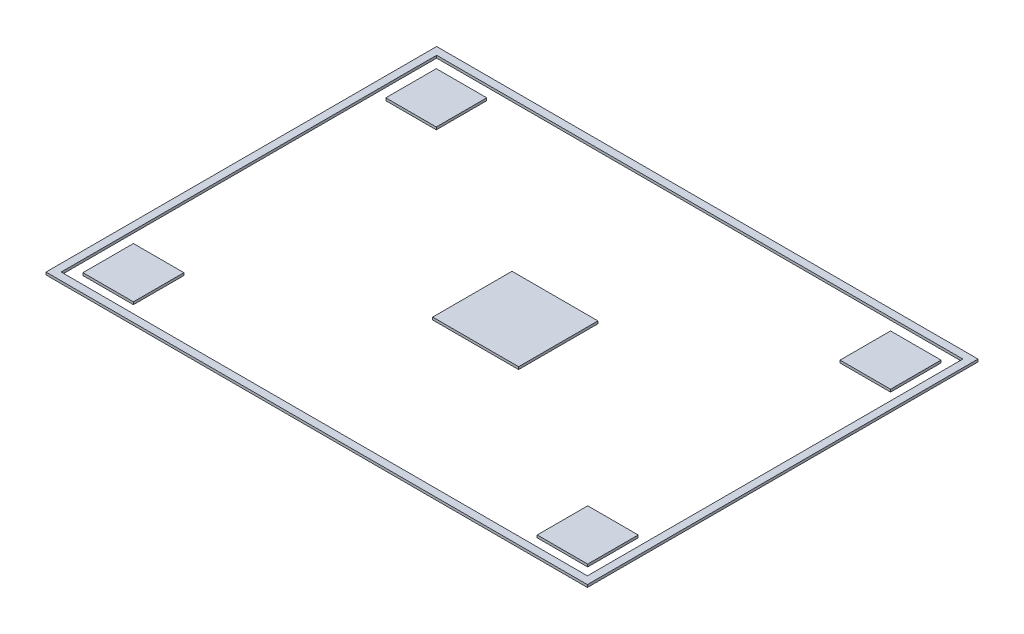
ISO-10303-21;
HEADER;
FILE_DESCRIPTION(('STEP AP214'),'2;1');
FILE_NAME('part.step','',(''),(''),'','','');
FILE_SCHEMA(('AUTOMOTIVE_DESIGN { 1 0 10303 214 1 1 1 1 }'));
ENDSEC;
DATA;
#1=APPLICATION_CONTEXT('core data for automotive mechanical design processes');
#2=APPLICATION_PROTOCOL_DEFINITION('international standard','automotive_design',2000,#1);
#3=PRODUCT_CONTEXT('',#1,'mechanical');
#4=PRODUCT('Part','Part','',(#3));
#5=PRODUCT_RELATED_PRODUCT_CATEGORY('part','',(#4));
#6=PRODUCT_DEFINITION_FORMATION('','',#4);
#7=PRODUCT_DEFINITION_CONTEXT('part definition',#1,'design');
#8=PRODUCT_DEFINITION('design','',#6,#7);
#9=PRODUCT_DEFINITION_SHAPE('','',#8);
#10=(LENGTH_UNIT() NAMED_UNIT(*) SI_UNIT(.MILLI.,.METRE.));
#11=(NAMED_UNIT(*) PLANE_ANGLE_UNIT() SI_UNIT($,.RADIAN.));
#12=(NAMED_UNIT(*) SI_UNIT($,.STERADIAN.) SOLID_ANGLE_UNIT());
#13=UNCERTAINTY_MEASURE_WITH_UNIT(LENGTH_MEASURE(1.E-05),#10,'distance_accuracy_value','');
#14=(GEOMETRIC_REPRESENTATION_CONTEXT(3) GLOBAL_UNCERTAINTY_ASSIGNED_CONTEXT((#13)) GLOBAL_UNIT_ASSIGNED_CONTEXT((#10,
#11,#12)) REPRESENTATION_CONTEXT('',''));
#15=CARTESIAN_POINT('',(0.,0.,0.));
#16=DIRECTION('',(0.,0.,1.));
#17=DIRECTION('',(1.,0.,0.));
#18=AXIS2_PLACEMENT_3D('',#15,#16,#17);
#19=CARTESIAN_POINT('',(180.,1.,0.));
#20=DIRECTION('',(1.,0.,0.));
#21=DIRECTION('',(0.,0.,-1.));
#22=AXIS2_PLACEMENT_3D('',#19,#20,#21);
#23=PLANE('',#22);
#24=DIRECTION('',(0.,0.,1.));
#25=VECTOR('',#24,1.);
#26=CARTESIAN_POINT('',(180.,0.,0.));
#27=LINE('',#26,#25);
#28=CARTESIAN_POINT('',(180.,0.,0.));
#29=VERTEX_POINT('',#28);
#30=CARTESIAN_POINT('',(180.,0.,20.));
#31=VERTEX_POINT('',#30);
#32=EDGE_CURVE('E231',#29,#31,#27,.T.);
#33=ORIENTED_EDGE('',*,*,#32,.T.);
#34=DIRECTION('',(0.,-1.,0.));
#35=VECTOR('',#34,1.);
#36=CARTESIAN_POINT('',(180.,1.,20.));
#37=LINE('',#36,#35);
#38=CARTESIAN_POINT('',(180.,1.,20.));
#39=VERTEX_POINT('',#38);
#40=EDGE_CURVE('E13',#39,#31,#37,.T.);
#41=ORIENTED_EDGE('',*,*,#40,.F.);
#42=DIRECTION('',(0.,0.,1.));
#43=VECTOR('',#42,1.);
#44=CARTESIAN_POINT('',(180.,1.,0.));
#45=LINE('',#44,#43);
#46=CARTESIAN_POINT('',(180.,1.,0.));
#47=VERTEX_POINT('',#46);
#48=EDGE_CURVE('E217',#47,#39,#45,.T.);
#49=ORIENTED_EDGE('',*,*,#48,.F.);
#50=DIRECTION('',(0.,-1.,0.));
#51=VECTOR('',#50,1.);
#52=CARTESIAN_POINT('',(180.,1.,0.));
#53=LINE('',#52,#51);
#54=EDGE_CURVE('E184',#47,#29,#53,.T.);
#55=ORIENTED_EDGE('',*,*,#54,.T.);
#56=EDGE_LOOP('',(#33,#41,#49,#55));
#57=FACE_BOUND('',#56,.T.);
#58=ADVANCED_FACE('F168',(#57),#23,.F.);
#59=CARTESIAN_POINT('',(0.,1.,20.));
#60=DIRECTION('',(0.,0.,-1.));
#61=DIRECTION('',(-1.,0.,0.));
#62=AXIS2_PLACEMENT_3D('',#59,#60,#61);
#63=PLANE('',#62);
#64=DIRECTION('',(1.,0.,0.));
#65=VECTOR('',#64,1.);
#66=CARTESIAN_POINT('',(0.,0.,20.));
#67=LINE('',#66,#65);
#68=CARTESIAN_POINT('',(200.,0.,20.));
#69=VERTEX_POINT('',#68);
#70=EDGE_CURVE('E222',#31,#69,#67,.T.);
#71=ORIENTED_EDGE('',*,*,#70,.T.);
#72=DIRECTION('',(0.,-1.,0.));
#73=VECTOR('',#72,1.);
#74=CARTESIAN_POINT('',(200.,1.,20.));
#75=LINE('',#74,#73);
#76=CARTESIAN_POINT('',(200.,1.,20.));
#77=VERTEX_POINT('',#76);
#78=EDGE_CURVE('E176',#77,#69,#75,.T.);
#79=ORIENTED_EDGE('',*,*,#78,.F.);
#80=DIRECTION('',(1.,0.,0.));
#81=VECTOR('',#80,1.);
#82=CARTESIAN_POINT('',(0.,1.,20.));
#83=LINE('',#82,#81);
#84=EDGE_CURVE('E209',#39,#77,#83,.T.);
#85=ORIENTED_EDGE('',*,*,#84,.F.);
#86=ORIENTED_EDGE('',*,*,#40,.T.);
#87=EDGE_LOOP('',(#71,#79,#85,#86));
#88=FACE_BOUND('',#87,.T.);
#89=ADVANCED_FACE('F221',(#88),#63,.F.);
#90=CARTESIAN_POINT('',(200.,1.,-2.77555756156289E-13));
#91=DIRECTION('',(1.,0.,0.));
#92=DIRECTION('',(0.,0.,-1.));
#93=AXIS2_PLACEMENT_3D('',#90,#91,#92);
#94=PLANE('',#93);
#95=DIRECTION('',(0.,0.,1.));
#96=VECTOR('',#95,1.);
#97=CARTESIAN_POINT('',(200.,0.,-2.77555756156289E-13));
#98=LINE('',#97,#96);
#99=CARTESIAN_POINT('',(200.,0.,0.));
#100=VERTEX_POINT('',#99);
#101=EDGE_CURVE('E234',#100,#69,#98,.T.);
#102=ORIENTED_EDGE('',*,*,#101,.F.);
#103=DIRECTION('',(0.,-1.,0.));
#104=VECTOR('',#103,1.);
#105=CARTESIAN_POINT('',(200.,1.,0.));
#106=LINE('',#105,#104);
#107=CARTESIAN_POINT('',(200.,1.,0.));
#108=VERTEX_POINT('',#107);
#109=EDGE_CURVE('E198',#108,#100,#106,.T.);
#110=ORIENTED_EDGE('',*,*,#109,.F.);
#111=DIRECTION('',(0.,0.,1.));
#112=VECTOR('',#111,1.);
#113=CARTESIAN_POINT('',(200.,1.,-2.77555756156289E-13));
#114=LINE('',#113,#112);
#115=EDGE_CURVE('E216',#108,#77,#114,.T.);
#116=ORIENTED_EDGE('',*,*,#115,.T.);
#117=ORIENTED_EDGE('',*,*,#78,.T.);
#118=EDGE_LOOP('',(#102,#110,#116,#117));
#119=FACE_BOUND('',#118,.T.);
#120=ADVANCED_FACE('F225',(#119),#94,.T.);
#121=CARTESIAN_POINT('',(0.,1.,0.));
#122=DIRECTION('',(0.,0.,-1.));
#123=DIRECTION('',(-1.,0.,0.));
#124=AXIS2_PLACEMENT_3D('',#121,#122,#123);
#125=PLANE('',#124);
#126=DIRECTION('',(1.,0.,0.));
#127=VECTOR('',#126,1.);
#128=CARTESIAN_POINT('',(0.,0.,0.));
#129=LINE('',#128,#127);
#130=EDGE_CURVE('E236',#29,#100,#129,.T.);
#131=ORIENTED_EDGE('',*,*,#130,.F.);
#132=ORIENTED_EDGE('',*,*,#54,.F.);
#133=DIRECTION('',(1.,0.,0.));
#134=VECTOR('',#133,1.);
#135=CARTESIAN_POINT('',(0.,1.,0.));
#136=LINE('',#135,#134);
#137=EDGE_CURVE('E226',#47,#108,#136,.T.);
#138=ORIENTED_EDGE('',*,*,#137,.T.);
#139=ORIENTED_EDGE('',*,*,#109,.T.);
#140=EDGE_LOOP('',(#131,#132,#138,#139));
#141=FACE_BOUND('',#140,.T.);
#142=ADVANCED_FACE('F242',(#141),#125,.T.);
#143=CARTESIAN_POINT('',(0.,1.,0.));
#144=DIRECTION('',(0.,1.,0.));
#145=DIRECTION('',(0.,0.,1.));
#146=AXIS2_PLACEMENT_3D('',#143,#144,#145);
#147=PLANE('',#146);
#148=ORIENTED_EDGE('',*,*,#48,.T.);
#149=ORIENTED_EDGE('',*,*,#84,.T.);
#150=ORIENTED_EDGE('',*,*,#115,.F.);
#151=ORIENTED_EDGE('',*,*,#137,.F.);
#152=EDGE_LOOP('',(#148,#149,#150,#151));
#153=FACE_BOUND('',#152,.T.);
#154=ADVANCED_FACE('F213',(#153),#147,.T.);
#155=CARTESIAN_POINT('',(0.,0.,0.));
#156=DIRECTION('',(0.,1.,0.));
#157=DIRECTION('',(0.,0.,1.));
#158=AXIS2_PLACEMENT_3D('',#155,#156,#157);
#159=PLANE('',#158);
#160=ORIENTED_EDGE('',*,*,#32,.F.);
#161=ORIENTED_EDGE('',*,*,#130,.T.);
#162=ORIENTED_EDGE('',*,*,#101,.T.);
#163=ORIENTED_EDGE('',*,*,#70,.F.);
#164=EDGE_LOOP('',(#160,#161,#162,#163));
#165=FACE_BOUND('',#164,.T.);
#166=ADVANCED_FACE('F241',(#165),#159,.F.);
#167=CLOSED_SHELL('',(#58,#89,#120,#142,#154,#166));
#168=MANIFOLD_SOLID_BREP('B2',#167);
#169=CARTESIAN_POINT('',(180.,1.,0.));
#170=DIRECTION('',(1.,0.,0.));
#171=DIRECTION('',(0.,0.,-1.));
#172=AXIS2_PLACEMENT_3D('',#169,#170,#171);
#173=PLANE('',#172);
#174=DIRECTION('',(0.,0.,1.));
#175=VECTOR('',#174,1.);
#176=CARTESIAN_POINT('',(180.,0.,0.));
#177=LINE('',#176,#175);
#178=CARTESIAN_POINT('',(180.,0.,-120.));
#179=VERTEX_POINT('',#178);
#180=CARTESIAN_POINT('',(180.,0.,-100.));
#181=VERTEX_POINT('',#180);
#182=EDGE_CURVE('E365',#179,#181,#177,.T.);
#183=ORIENTED_EDGE('',*,*,#182,.T.);
#184=DIRECTION('',(0.,-1.,0.));
#185=VECTOR('',#184,1.);
#186=CARTESIAN_POINT('',(180.,1.,-100.));
#187=LINE('',#186,#185);
#188=CARTESIAN_POINT('',(180.,1.,-100.));
#189=VERTEX_POINT('',#188);
#190=EDGE_CURVE('E166',#189,#181,#187,.T.);
#191=ORIENTED_EDGE('',*,*,#190,.F.);
#192=DIRECTION('',(0.,0.,1.));
#193=VECTOR('',#192,1.);
#194=CARTESIAN_POINT('',(180.,1.,0.));
#195=LINE('',#194,#193);
#196=CARTESIAN_POINT('',(180.,1.,-120.));
#197=VERTEX_POINT('',#196);
#198=EDGE_CURVE('E351',#197,#189,#195,.T.);
#199=ORIENTED_EDGE('',*,*,#198,.F.);
#200=DIRECTION('',(0.,-1.,0.));
#201=VECTOR('',#200,1.);
#202=CARTESIAN_POINT('',(180.,1.,-120.));
#203=LINE('',#202,#201);
#204=EDGE_CURVE('E318',#197,#179,#203,.T.);
#205=ORIENTED_EDGE('',*,*,#204,.T.);
#206=EDGE_LOOP('',(#183,#191,#199,#205));
#207=FACE_BOUND('',#206,.T.);
#208=ADVANCED_FACE('F302',(#207),#173,.F.);
#209=CARTESIAN_POINT('',(0.,1.,-100.));
#210=DIRECTION('',(0.,0.,-1.));
#211=DIRECTION('',(-1.,0.,0.));
#212=AXIS2_PLACEMENT_3D('',#209,#210,#211);
#213=PLANE('',#212);
#214=DIRECTION('',(1.,0.,0.));
#215=VECTOR('',#214,1.);
#216=CARTESIAN_POINT('',(0.,0.,-100.));
#217=LINE('',#216,#215);
#218=CARTESIAN_POINT('',(200.,0.,-100.));
#219=VERTEX_POINT('',#218);
#220=EDGE_CURVE('E356',#181,#219,#217,.T.);
#221=ORIENTED_EDGE('',*,*,#220,.T.);
#222=DIRECTION('',(0.,-1.,0.));
#223=VECTOR('',#222,1.);
#224=CARTESIAN_POINT('',(200.,1.,-100.));
#225=LINE('',#224,#223);
#226=CARTESIAN_POINT('',(200.,1.,-100.));
#227=VERTEX_POINT('',#226);
#228=EDGE_CURVE('E310',#227,#219,#225,.T.);
#229=ORIENTED_EDGE('',*,*,#228,.F.);
#230=DIRECTION('',(1.,0.,0.));
#231=VECTOR('',#230,1.);
#232=CARTESIAN_POINT('',(0.,1.,-100.));
#233=LINE('',#232,#231);
#234=EDGE_CURVE('E343',#189,#227,#233,.T.);
#235=ORIENTED_EDGE('',*,*,#234,.F.);
#236=ORIENTED_EDGE('',*,*,#190,.T.);
#237=EDGE_LOOP('',(#221,#229,#235,#236));
#238=FACE_BOUND('',#237,.T.);
#239=ADVANCED_FACE('F355',(#238),#213,.F.);
#240=CARTESIAN_POINT('',(200.,1.,0.));
#241=DIRECTION('',(1.,0.,0.));
#242=DIRECTION('',(0.,0.,-1.));
#243=AXIS2_PLACEMENT_3D('',#240,#241,#242);
#244=PLANE('',#243);
#245=DIRECTION('',(0.,0.,1.));
#246=VECTOR('',#245,1.);
#247=CARTESIAN_POINT('',(200.,0.,0.));
#248=LINE('',#247,#246);
#249=CARTESIAN_POINT('',(200.,0.,-120.));
#250=VERTEX_POINT('',#249);
#251=EDGE_CURVE('E368',#250,#219,#248,.T.);
#252=ORIENTED_EDGE('',*,*,#251,.F.);
#253=DIRECTION('',(0.,-1.,0.));
#254=VECTOR('',#253,1.);
#255=CARTESIAN_POINT('',(200.,1.,-120.));
#256=LINE('',#255,#254);
#257=CARTESIAN_POINT('',(200.,1.,-120.));
#258=VERTEX_POINT('',#257);
#259=EDGE_CURVE('E332',#258,#250,#256,.T.);
#260=ORIENTED_EDGE('',*,*,#259,.F.);
#261=DIRECTION('',(0.,0.,1.));
#262=VECTOR('',#261,1.);
#263=CARTESIAN_POINT('',(200.,1.,0.));
#264=LINE('',#263,#262);
#265=EDGE_CURVE('E350',#258,#227,#264,.T.);
#266=ORIENTED_EDGE('',*,*,#265,.T.);
#267=ORIENTED_EDGE('',*,*,#228,.T.);
#268=EDGE_LOOP('',(#252,#260,#266,#267));
#269=FACE_BOUND('',#268,.T.);
#270=ADVANCED_FACE('F359',(#269),#244,.T.);
#271=CARTESIAN_POINT('',(0.,1.,-120.));
#272=DIRECTION('',(0.,0.,-1.));
#273=DIRECTION('',(-1.,0.,0.));
#274=AXIS2_PLACEMENT_3D('',#271,#272,#273);
#275=PLANE('',#274);
#276=DIRECTION('',(1.,0.,0.));
#277=VECTOR('',#276,1.);
#278=CARTESIAN_POINT('',(0.,0.,-120.));
#279=LINE('',#278,#277);
#280=EDGE_CURVE('E370',#179,#250,#279,.T.);
#281=ORIENTED_EDGE('',*,*,#280,.F.);
#282=ORIENTED_EDGE('',*,*,#204,.F.);
#283=DIRECTION('',(1.,0.,0.));
#284=VECTOR('',#283,1.);
#285=CARTESIAN_POINT('',(0.,1.,-120.));
#286=LINE('',#285,#284);
#287=EDGE_CURVE('E360',#197,#258,#286,.T.);
#288=ORIENTED_EDGE('',*,*,#287,.T.);
#289=ORIENTED_EDGE('',*,*,#259,.T.);
#290=EDGE_LOOP('',(#281,#282,#288,#289));
#291=FACE_BOUND('',#290,.T.);
#292=ADVANCED_FACE('F376',(#291),#275,.T.);
#293=CARTESIAN_POINT('',(0.,1.,0.));
#294=DIRECTION('',(0.,1.,0.));
#295=DIRECTION('',(0.,0.,1.));
#296=AXIS2_PLACEMENT_3D('',#293,#294,#295);
#297=PLANE('',#296);
#298=ORIENTED_EDGE('',*,*,#198,.T.);
#299=ORIENTED_EDGE('',*,*,#234,.T.);
#300=ORIENTED_EDGE('',*,*,#265,.F.);
#301=ORIENTED_EDGE('',*,*,#287,.F.);
#302=EDGE_LOOP('',(#298,#299,#300,#301));
#303=FACE_BOUND('',#302,.T.);
#304=ADVANCED_FACE('F347',(#303),#297,.T.);
#305=CARTESIAN_POINT('',(0.,0.,0.));
#306=DIRECTION('',(0.,1.,0.));
#307=DIRECTION('',(0.,0.,1.));
#308=AXIS2_PLACEMENT_3D('',#305,#306,#307);
#309=PLANE('',#308);
#310=ORIENTED_EDGE('',*,*,#182,.F.);
#311=ORIENTED_EDGE('',*,*,#280,.T.);
#312=ORIENTED_EDGE('',*,*,#251,.T.);
#313=ORIENTED_EDGE('',*,*,#220,.F.);
#314=EDGE_LOOP('',(#310,#311,#312,#313));
#315=FACE_BOUND('',#314,.T.);
#316=ADVANCED_FACE('F375',(#315),#309,.F.);
#317=CLOSED_SHELL('',(#208,#239,#270,#292,#304,#316));
#318=MANIFOLD_SOLID_BREP('B7',#317);
#319=CARTESIAN_POINT('',(118.576882843781,1.,0.));
#320=DIRECTION('',(1.,0.,0.));
#321=DIRECTION('',(0.,0.,-1.));
#322=AXIS2_PLACEMENT_3D('',#319,#320,#321);
#323=PLANE('',#322);
#324=DIRECTION('',(0.,0.,1.));
#325=VECTOR('',#324,1.);
#326=CARTESIAN_POINT('',(118.576882843781,0.,0.));
#327=LINE('',#326,#325);
#328=CARTESIAN_POINT('',(118.576882843781,0.,-65.4798375081286));
#329=VERTEX_POINT('',#328);
#330=CARTESIAN_POINT('',(118.576882843781,0.,-34.0476681124407));
#331=VERTEX_POINT('',#330);
#332=EDGE_CURVE('E499',#329,#331,#327,.T.);
#333=ORIENTED_EDGE('',*,*,#332,.F.);
#334=DIRECTION('',(0.,-1.,0.));
#335=VECTOR('',#334,1.);
#336=CARTESIAN_POINT('',(118.576882843781,1.,-65.4798375081286));
#337=LINE('',#336,#335);
#338=CARTESIAN_POINT('',(118.576882843781,1.,-65.4798375081286));
#339=VERTEX_POINT('',#338);
#340=EDGE_CURVE('E300',#339,#329,#337,.T.);
#341=ORIENTED_EDGE('',*,*,#340,.F.);
#342=DIRECTION('',(0.,0.,1.));
#343=VECTOR('',#342,1.);
#344=CARTESIAN_POINT('',(118.576882843781,1.,0.));
#345=LINE('',#344,#343);
#346=CARTESIAN_POINT('',(118.576882843781,1.,-34.0476681124407));
#347=VERTEX_POINT('',#346);
#348=EDGE_CURVE('E493',#339,#347,#345,.T.);
#349=ORIENTED_EDGE('',*,*,#348,.T.);
#350=DIRECTION('',(0.,-1.,0.));
#351=VECTOR('',#350,1.);
#352=CARTESIAN_POINT('',(118.576882843781,1.,-34.0476681124407));
#353=LINE('',#352,#351);
#354=EDGE_CURVE('E474',#347,#331,#353,.T.);
#355=ORIENTED_EDGE('',*,*,#354,.T.);
#356=EDGE_LOOP('',(#333,#341,#349,#355));
#357=FACE_BOUND('',#356,.T.);
#358=ADVANCED_FACE('F436',(#357),#323,.T.);
#359=CARTESIAN_POINT('',(0.,1.,-65.4798375081286));
#360=DIRECTION('',(0.,0.,-1.));
#361=DIRECTION('',(-1.,0.,0.));
#362=AXIS2_PLACEMENT_3D('',#359,#360,#361);
#363=PLANE('',#362);
#364=DIRECTION('',(1.,0.,0.));
#365=VECTOR('',#364,1.);
#366=CARTESIAN_POINT('',(0.,0.,-65.4798375081286));
#367=LINE('',#366,#365);
#368=CARTESIAN_POINT('',(84.5253659984525,0.,-65.4798375081286));
#369=VERTEX_POINT('',#368);
#370=EDGE_CURVE('E487',#369,#329,#367,.T.);
#371=ORIENTED_EDGE('',*,*,#370,.F.);
#372=DIRECTION('',(0.,-1.,0.));
#373=VECTOR('',#372,1.);
#374=CARTESIAN_POINT('',(84.5253659984525,1.,-65.4798375081286));
#375=LINE('',#374,#373);
#376=CARTESIAN_POINT('',(84.5253659984525,1.,-65.4798375081286));
#377=VERTEX_POINT('',#376);
#378=EDGE_CURVE('E444',#377,#369,#375,.T.);
#379=ORIENTED_EDGE('',*,*,#378,.F.);
#380=DIRECTION('',(1.,0.,0.));
#381=VECTOR('',#380,1.);
#382=CARTESIAN_POINT('',(0.,1.,-65.4798375081286));
#383=LINE('',#382,#381);
#384=EDGE_CURVE('E485',#377,#339,#383,.T.);
#385=ORIENTED_EDGE('',*,*,#384,.T.);
#386=ORIENTED_EDGE('',*,*,#340,.T.);
#387=EDGE_LOOP('',(#371,#379,#385,#386));
#388=FACE_BOUND('',#387,.T.);
#389=ADVANCED_FACE('F483',(#388),#363,.T.);
#390=CARTESIAN_POINT('',(84.5253659984525,1.,0.));
#391=DIRECTION('',(1.,0.,0.));
#392=DIRECTION('',(0.,0.,-1.));
#393=AXIS2_PLACEMENT_3D('',#390,#391,#392);
#394=PLANE('',#393);
#395=DIRECTION('',(0.,0.,1.));
#396=VECTOR('',#395,1.);
#397=CARTESIAN_POINT('',(84.5253659984525,0.,0.));
#398=LINE('',#397,#396);
#399=CARTESIAN_POINT('',(84.5253659984525,0.,-34.0476681124407));
#400=VERTEX_POINT('',#399);
#401=EDGE_CURVE('E467',#369,#400,#398,.T.);
#402=ORIENTED_EDGE('',*,*,#401,.T.);
#403=DIRECTION('',(0.,-1.,0.));
#404=VECTOR('',#403,1.);
#405=CARTESIAN_POINT('',(84.5253659984525,1.,-34.0476681124407));
#406=LINE('',#405,#404);
#407=CARTESIAN_POINT('',(84.5253659984525,1.,-34.0476681124407));
#408=VERTEX_POINT('',#407);
#409=EDGE_CURVE('E488',#408,#400,#406,.T.);
#410=ORIENTED_EDGE('',*,*,#409,.F.);
#411=DIRECTION('',(0.,0.,1.));
#412=VECTOR('',#411,1.);
#413=CARTESIAN_POINT('',(84.5253659984525,1.,0.));
#414=LINE('',#413,#412);
#415=EDGE_CURVE('E489',#377,#408,#414,.T.);
#416=ORIENTED_EDGE('',*,*,#415,.F.);
#417=ORIENTED_EDGE('',*,*,#378,.T.);
#418=EDGE_LOOP('',(#402,#410,#416,#417));
#419=FACE_BOUND('',#418,.T.);
#420=ADVANCED_FACE('F490',(#419),#394,.F.);
#421=CARTESIAN_POINT('',(0.,1.,-34.0476681124407));
#422=DIRECTION('',(0.,0.,-1.));
#423=DIRECTION('',(-1.,0.,0.));
#424=AXIS2_PLACEMENT_3D('',#421,#422,#423);
#425=PLANE('',#424);
#426=DIRECTION('',(1.,0.,0.));
#427=VECTOR('',#426,1.);
#428=CARTESIAN_POINT('',(0.,0.,-34.0476681124407));
#429=LINE('',#428,#427);
#430=EDGE_CURVE('E495',#400,#331,#429,.T.);
#431=ORIENTED_EDGE('',*,*,#430,.T.);
#432=ORIENTED_EDGE('',*,*,#354,.F.);
#433=DIRECTION('',(1.,0.,0.));
#434=VECTOR('',#433,1.);
#435=CARTESIAN_POINT('',(0.,1.,-34.0476681124407));
#436=LINE('',#435,#434);
#437=EDGE_CURVE('E452',#408,#347,#436,.T.);
#438=ORIENTED_EDGE('',*,*,#437,.F.);
#439=ORIENTED_EDGE('',*,*,#409,.T.);
#440=EDGE_LOOP('',(#431,#432,#438,#439));
#441=FACE_BOUND('',#440,.T.);
#442=ADVANCED_FACE('F508',(#441),#425,.F.);
#443=CARTESIAN_POINT('',(0.,1.,0.));
#444=DIRECTION('',(0.,1.,0.));
#445=DIRECTION('',(0.,0.,1.));
#446=AXIS2_PLACEMENT_3D('',#443,#444,#445);
#447=PLANE('',#446);
#448=ORIENTED_EDGE('',*,*,#348,.F.);
#449=ORIENTED_EDGE('',*,*,#384,.F.);
#450=ORIENTED_EDGE('',*,*,#415,.T.);
#451=ORIENTED_EDGE('',*,*,#437,.T.);
#452=EDGE_LOOP('',(#448,#449,#450,#451));
#453=FACE_BOUND('',#452,.T.);
#454=ADVANCED_FACE('F492',(#453),#447,.T.);
#455=CARTESIAN_POINT('',(0.,0.,0.));
#456=DIRECTION('',(0.,1.,0.));
#457=DIRECTION('',(0.,0.,1.));
#458=AXIS2_PLACEMENT_3D('',#455,#456,#457);
#459=PLANE('',#458);
#460=ORIENTED_EDGE('',*,*,#332,.T.);
#461=ORIENTED_EDGE('',*,*,#430,.F.);
#462=ORIENTED_EDGE('',*,*,#401,.F.);
#463=ORIENTED_EDGE('',*,*,#370,.T.);
#464=EDGE_LOOP('',(#460,#461,#462,#463));
#465=FACE_BOUND('',#464,.T.);
#466=ADVANCED_FACE('F510',(#465),#459,.F.);
#467=CLOSED_SHELL('',(#358,#389,#420,#442,#454,#466));
#468=MANIFOLD_SOLID_BREP('B160',#467);
#469=CARTESIAN_POINT('',(20.,1.,0.));
#470=DIRECTION('',(1.,0.,0.));
#471=DIRECTION('',(0.,0.,-1.));
#472=AXIS2_PLACEMENT_3D('',#469,#470,#471);
#473=PLANE('',#472);
#474=DIRECTION('',(0.,0.,1.));
#475=VECTOR('',#474,1.);
#476=CARTESIAN_POINT('',(20.,0.,0.));
#477=LINE('',#476,#475);
#478=CARTESIAN_POINT('',(20.,0.,0.));
#479=VERTEX_POINT('',#478);
#480=CARTESIAN_POINT('',(20.,0.,20.));
#481=VERTEX_POINT('',#480);
#482=EDGE_CURVE('E633',#479,#481,#477,.T.);
#483=ORIENTED_EDGE('',*,*,#482,.F.);
#484=DIRECTION('',(0.,-1.,0.));
#485=VECTOR('',#484,1.);
#486=CARTESIAN_POINT('',(20.,1.,0.));
#487=LINE('',#486,#485);
#488=CARTESIAN_POINT('',(20.,1.,0.));
#489=VERTEX_POINT('',#488);
#490=EDGE_CURVE('E434',#489,#479,#487,.T.);
#491=ORIENTED_EDGE('',*,*,#490,.F.);
#492=DIRECTION('',(0.,0.,1.));
#493=VECTOR('',#492,1.);
#494=CARTESIAN_POINT('',(20.,1.,0.));
#495=LINE('',#494,#493);
#496=CARTESIAN_POINT('',(20.,1.,20.));
#497=VERTEX_POINT('',#496);
#498=EDGE_CURVE('E627',#489,#497,#495,.T.);
#499=ORIENTED_EDGE('',*,*,#498,.T.);
#500=DIRECTION('',(0.,-1.,0.));
#501=VECTOR('',#500,1.);
#502=CARTESIAN_POINT('',(20.,1.,20.));
#503=LINE('',#502,#501);
#504=EDGE_CURVE('E608',#497,#481,#503,.T.);
#505=ORIENTED_EDGE('',*,*,#504,.T.);
#506=EDGE_LOOP('',(#483,#491,#499,#505));
#507=FACE_BOUND('',#506,.T.);
#508=ADVANCED_FACE('F570',(#507),#473,.T.);
#509=CARTESIAN_POINT('',(0.,1.,0.));
#510=DIRECTION('',(0.,0.,-1.));
#511=DIRECTION('',(-1.,0.,0.));
#512=AXIS2_PLACEMENT_3D('',#509,#510,#511);
#513=PLANE('',#512);
#514=DIRECTION('',(1.,0.,0.));
#515=VECTOR('',#514,1.);
#516=CARTESIAN_POINT('',(0.,0.,0.));
#517=LINE('',#516,#515);
#518=CARTESIAN_POINT('',(0.,0.,0.));
#519=VERTEX_POINT('',#518);
#520=EDGE_CURVE('E621',#519,#479,#517,.T.);
#521=ORIENTED_EDGE('',*,*,#520,.F.);
#522=DIRECTION('',(0.,-1.,0.));
#523=VECTOR('',#522,1.);
#524=CARTESIAN_POINT('',(0.,1.,0.));
#525=LINE('',#524,#523);
#526=CARTESIAN_POINT('',(0.,1.,0.));
#527=VERTEX_POINT('',#526);
#528=EDGE_CURVE('E578',#527,#519,#525,.T.);
#529=ORIENTED_EDGE('',*,*,#528,.F.);
#530=DIRECTION('',(1.,0.,0.));
#531=VECTOR('',#530,1.);
#532=CARTESIAN_POINT('',(0.,1.,0.));
#533=LINE('',#532,#531);
#534=EDGE_CURVE('E619',#527,#489,#533,.T.);
#535=ORIENTED_EDGE('',*,*,#534,.T.);
#536=ORIENTED_EDGE('',*,*,#490,.T.);
#537=EDGE_LOOP('',(#521,#529,#535,#536));
#538=FACE_BOUND('',#537,.T.);
#539=ADVANCED_FACE('F617',(#538),#513,.T.);
#540=CARTESIAN_POINT('',(0.,1.,0.));
#541=DIRECTION('',(1.,0.,0.));
#542=DIRECTION('',(0.,0.,-1.));
#543=AXIS2_PLACEMENT_3D('',#540,#541,#542);
#544=PLANE('',#543);
#545=DIRECTION('',(0.,0.,1.));
#546=VECTOR('',#545,1.);
#547=CARTESIAN_POINT('',(0.,0.,0.));
#548=LINE('',#547,#546);
#549=CARTESIAN_POINT('',(0.,0.,20.));
#550=VERTEX_POINT('',#549);
#551=EDGE_CURVE('E601',#519,#550,#548,.T.);
#552=ORIENTED_EDGE('',*,*,#551,.T.);
#553=DIRECTION('',(0.,-1.,0.));
#554=VECTOR('',#553,1.);
#555=CARTESIAN_POINT('',(0.,1.,20.));
#556=LINE('',#555,#554);
#557=CARTESIAN_POINT('',(0.,1.,20.));
#558=VERTEX_POINT('',#557);
#559=EDGE_CURVE('E622',#558,#550,#556,.T.);
#560=ORIENTED_EDGE('',*,*,#559,.F.);
#561=DIRECTION('',(0.,0.,1.));
#562=VECTOR('',#561,1.);
#563=CARTESIAN_POINT('',(0.,1.,0.));
#564=LINE('',#563,#562);
#565=EDGE_CURVE('E623',#527,#558,#564,.T.);
#566=ORIENTED_EDGE('',*,*,#565,.F.);
#567=ORIENTED_EDGE('',*,*,#528,.T.);
#568=EDGE_LOOP('',(#552,#560,#566,#567));
#569=FACE_BOUND('',#568,.T.);
#570=ADVANCED_FACE('F624',(#569),#544,.F.);
#571=CARTESIAN_POINT('',(0.,1.,20.));
#572=DIRECTION('',(0.,0.,-1.));
#573=DIRECTION('',(-1.,0.,0.));
#574=AXIS2_PLACEMENT_3D('',#571,#572,#573);
#575=PLANE('',#574);
#576=DIRECTION('',(1.,0.,0.));
#577=VECTOR('',#576,1.);
#578=CARTESIAN_POINT('',(0.,0.,20.));
#579=LINE('',#578,#577);
#580=EDGE_CURVE('E629',#550,#481,#579,.T.);
#581=ORIENTED_EDGE('',*,*,#580,.T.);
#582=ORIENTED_EDGE('',*,*,#504,.F.);
#583=DIRECTION('',(1.,0.,0.));
#584=VECTOR('',#583,1.);
#585=CARTESIAN_POINT('',(0.,1.,20.));
#586=LINE('',#585,#584);
#587=EDGE_CURVE('E586',#558,#497,#586,.T.);
#588=ORIENTED_EDGE('',*,*,#587,.F.);
#589=ORIENTED_EDGE('',*,*,#559,.T.);
#590=EDGE_LOOP('',(#581,#582,#588,#589));
#591=FACE_BOUND('',#590,.T.);
#592=ADVANCED_FACE('F642',(#591),#575,.F.);
#593=CARTESIAN_POINT('',(0.,1.,0.));
#594=DIRECTION('',(0.,1.,0.));
#595=DIRECTION('',(0.,0.,1.));
#596=AXIS2_PLACEMENT_3D('',#593,#594,#595);
#597=PLANE('',#596);
#598=ORIENTED_EDGE('',*,*,#498,.F.);
#599=ORIENTED_EDGE('',*,*,#534,.F.);
#600=ORIENTED_EDGE('',*,*,#565,.T.);
#601=ORIENTED_EDGE('',*,*,#587,.T.);
#602=EDGE_LOOP('',(#598,#599,#600,#601));
#603=FACE_BOUND('',#602,.T.);
#604=ADVANCED_FACE('F626',(#603),#597,.T.);
#605=CARTESIAN_POINT('',(0.,0.,0.));
#606=DIRECTION('',(0.,1.,0.));
#607=DIRECTION('',(0.,0.,1.));
#608=AXIS2_PLACEMENT_3D('',#605,#606,#607);
#609=PLANE('',#608);
#610=ORIENTED_EDGE('',*,*,#482,.T.);
#611=ORIENTED_EDGE('',*,*,#580,.F.);
#612=ORIENTED_EDGE('',*,*,#551,.F.);
#613=ORIENTED_EDGE('',*,*,#520,.T.);
#614=EDGE_LOOP('',(#610,#611,#612,#613));
#615=FACE_BOUND('',#614,.T.);
#616=ADVANCED_FACE('F644',(#615),#609,.F.);
#617=CLOSED_SHELL('',(#508,#539,#570,#592,#604,#616));
#618=MANIFOLD_SOLID_BREP('B294',#617);
#619=CARTESIAN_POINT('',(0.,1.,0.));
#620=DIRECTION('',(1.,0.,0.));
#621=DIRECTION('',(0.,0.,-1.));
#622=AXIS2_PLACEMENT_3D('',#619,#620,#621);
#623=PLANE('',#622);
#624=DIRECTION('',(0.,0.,1.));
#625=VECTOR('',#624,1.);
#626=CARTESIAN_POINT('',(0.,0.,0.));
#627=LINE('',#626,#625);
#628=CARTESIAN_POINT('',(0.,0.,-120.));
#629=VERTEX_POINT('',#628);
#630=CARTESIAN_POINT('',(0.,0.,-100.));
#631=VERTEX_POINT('',#630);
#632=EDGE_CURVE('E766',#629,#631,#627,.T.);
#633=ORIENTED_EDGE('',*,*,#632,.T.);
#634=DIRECTION('',(0.,-1.,0.));
#635=VECTOR('',#634,1.);
#636=CARTESIAN_POINT('',(0.,1.,-100.));
#637=LINE('',#636,#635);
#638=CARTESIAN_POINT('',(0.,1.,-100.));
#639=VERTEX_POINT('',#638);
#640=EDGE_CURVE('E568',#639,#631,#637,.T.);
#641=ORIENTED_EDGE('',*,*,#640,.F.);
#642=DIRECTION('',(0.,0.,1.));
#643=VECTOR('',#642,1.);
#644=CARTESIAN_POINT('',(0.,1.,0.));
#645=LINE('',#644,#643);
#646=CARTESIAN_POINT('',(0.,1.,-120.));
#647=VERTEX_POINT('',#646);
#648=EDGE_CURVE('E752',#647,#639,#645,.T.);
#649=ORIENTED_EDGE('',*,*,#648,.F.);
#650=DIRECTION('',(0.,-1.,0.));
#651=VECTOR('',#650,1.);
#652=CARTESIAN_POINT('',(0.,1.,-120.));
#653=LINE('',#652,#651);
#654=EDGE_CURVE('E719',#647,#629,#653,.T.);
#655=ORIENTED_EDGE('',*,*,#654,.T.);
#656=EDGE_LOOP('',(#633,#641,#649,#655));
#657=FACE_BOUND('',#656,.T.);
#658=ADVANCED_FACE('F703',(#657),#623,.F.);
#659=CARTESIAN_POINT('',(0.,1.,-100.));
#660=DIRECTION('',(0.,0.,-1.));
#661=DIRECTION('',(-1.,0.,0.));
#662=AXIS2_PLACEMENT_3D('',#659,#660,#661);
#663=PLANE('',#662);
#664=DIRECTION('',(1.,0.,0.));
#665=VECTOR('',#664,1.);
#666=CARTESIAN_POINT('',(0.,0.,-100.));
#667=LINE('',#666,#665);
#668=CARTESIAN_POINT('',(19.9999999999996,0.,-100.));
#669=VERTEX_POINT('',#668);
#670=EDGE_CURVE('E757',#631,#669,#667,.T.);
#671=ORIENTED_EDGE('',*,*,#670,.T.);
#672=DIRECTION('',(0.,-1.,0.));
#673=VECTOR('',#672,1.);
#674=CARTESIAN_POINT('',(19.9999999999996,1.,-100.));
#675=LINE('',#674,#673);
#676=CARTESIAN_POINT('',(19.9999999999996,1.,-100.));
#677=VERTEX_POINT('',#676);
#678=EDGE_CURVE('E711',#677,#669,#675,.T.);
#679=ORIENTED_EDGE('',*,*,#678,.F.);
#680=DIRECTION('',(1.,0.,0.));
#681=VECTOR('',#680,1.);
#682=CARTESIAN_POINT('',(0.,1.,-100.));
#683=LINE('',#682,#681);
#684=EDGE_CURVE('E744',#639,#677,#683,.T.);
#685=ORIENTED_EDGE('',*,*,#684,.F.);
#686=ORIENTED_EDGE('',*,*,#640,.T.);
#687=EDGE_LOOP('',(#671,#679,#685,#686));
#688=FACE_BOUND('',#687,.T.);
#689=ADVANCED_FACE('F756',(#688),#663,.F.);
#690=CARTESIAN_POINT('',(19.9999999999996,1.,0.));
#691=DIRECTION('',(1.,0.,0.));
#692=DIRECTION('',(0.,0.,-1.));
#693=AXIS2_PLACEMENT_3D('',#690,#691,#692);
#694=PLANE('',#693);
#695=DIRECTION('',(0.,0.,1.));
#696=VECTOR('',#695,1.);
#697=CARTESIAN_POINT('',(19.9999999999996,0.,0.));
#698=LINE('',#697,#696);
#699=CARTESIAN_POINT('',(19.9999999999996,0.,-120.));
#700=VERTEX_POINT('',#699);
#701=EDGE_CURVE('E769',#700,#669,#698,.T.);
#702=ORIENTED_EDGE('',*,*,#701,.F.);
#703=DIRECTION('',(0.,-1.,0.));
#704=VECTOR('',#703,1.);
#705=CARTESIAN_POINT('',(19.9999999999996,1.,-120.));
#706=LINE('',#705,#704);
#707=CARTESIAN_POINT('',(19.9999999999996,1.,-120.));
#708=VERTEX_POINT('',#707);
#709=EDGE_CURVE('E733',#708,#700,#706,.T.);
#710=ORIENTED_EDGE('',*,*,#709,.F.);
#711=DIRECTION('',(0.,0.,1.));
#712=VECTOR('',#711,1.);
#713=CARTESIAN_POINT('',(19.9999999999996,1.,0.));
#714=LINE('',#713,#712);
#715=EDGE_CURVE('E751',#708,#677,#714,.T.);
#716=ORIENTED_EDGE('',*,*,#715,.T.);
#717=ORIENTED_EDGE('',*,*,#678,.T.);
#718=EDGE_LOOP('',(#702,#710,#716,#717));
#719=FACE_BOUND('',#718,.T.);
#720=ADVANCED_FACE('F760',(#719),#694,.T.);
#721=CARTESIAN_POINT('',(0.,1.,-120.));
#722=DIRECTION('',(0.,0.,-1.));
#723=DIRECTION('',(-1.,0.,0.));
#724=AXIS2_PLACEMENT_3D('',#721,#722,#723);
#725=PLANE('',#724);
#726=DIRECTION('',(1.,0.,0.));
#727=VECTOR('',#726,1.);
#728=CARTESIAN_POINT('',(0.,0.,-120.));
#729=LINE('',#728,#727);
#730=EDGE_CURVE('E771',#629,#700,#729,.T.);
#731=ORIENTED_EDGE('',*,*,#730,.F.);
#732=ORIENTED_EDGE('',*,*,#654,.F.);
#733=DIRECTION('',(1.,0.,0.));
#734=VECTOR('',#733,1.);
#735=CARTESIAN_POINT('',(0.,1.,-120.));
#736=LINE('',#735,#734);
#737=EDGE_CURVE('E761',#647,#708,#736,.T.);
#738=ORIENTED_EDGE('',*,*,#737,.T.);
#739=ORIENTED_EDGE('',*,*,#709,.T.);
#740=EDGE_LOOP('',(#731,#732,#738,#739));
#741=FACE_BOUND('',#740,.T.);
#742=ADVANCED_FACE('F777',(#741),#725,.T.);
#743=CARTESIAN_POINT('',(0.,1.,0.));
#744=DIRECTION('',(0.,1.,0.));
#745=DIRECTION('',(0.,0.,1.));
#746=AXIS2_PLACEMENT_3D('',#743,#744,#745);
#747=PLANE('',#746);
#748=ORIENTED_EDGE('',*,*,#648,.T.);
#749=ORIENTED_EDGE('',*,*,#684,.T.);
#750=ORIENTED_EDGE('',*,*,#715,.F.);
#751=ORIENTED_EDGE('',*,*,#737,.F.);
#752=EDGE_LOOP('',(#748,#749,#750,#751));
#753=FACE_BOUND('',#752,.T.);
#754=ADVANCED_FACE('F748',(#753),#747,.T.);
#755=CARTESIAN_POINT('',(0.,0.,0.));
#756=DIRECTION('',(0.,1.,0.));
#757=DIRECTION('',(0.,0.,1.));
#758=AXIS2_PLACEMENT_3D('',#755,#756,#757);
#759=PLANE('',#758);
#760=ORIENTED_EDGE('',*,*,#632,.F.);
#761=ORIENTED_EDGE('',*,*,#730,.T.);
#762=ORIENTED_EDGE('',*,*,#701,.T.);
#763=ORIENTED_EDGE('',*,*,#670,.F.);
#764=EDGE_LOOP('',(#760,#761,#762,#763));
#765=FACE_BOUND('',#764,.T.);
#766=ADVANCED_FACE('F776',(#765),#759,.F.);
#767=CLOSED_SHELL('',(#658,#689,#720,#742,#754,#766));
#768=MANIFOLD_SOLID_BREP('B428',#767);
#769=CARTESIAN_POINT('',(0.,1.,-127.677089870007));
#770=DIRECTION('',(0.,0.,-1.));
#771=DIRECTION('',(-1.,0.,0.));
#772=AXIS2_PLACEMENT_3D('',#769,#770,#771);
#773=PLANE('',#772);
#774=DIRECTION('',(1.,0.,0.));
#775=VECTOR('',#774,1.);
#776=CARTESIAN_POINT('',(0.,0.,-127.677089870007));
#777=LINE('',#776,#775);
#778=CARTESIAN_POINT('',(-7.53244728932985,0.,-127.677089870007));
#779=VERTEX_POINT('',#778);
#780=CARTESIAN_POINT('',(206.967609702066,0.,-127.677089870007));
#781=VERTEX_POINT('',#780);
#782=EDGE_CURVE('E941',#779,#781,#777,.T.);
#783=ORIENTED_EDGE('',*,*,#782,.F.);
#784=DIRECTION('',(0.,-1.,0.));
#785=VECTOR('',#784,1.);
#786=CARTESIAN_POINT('',(-7.53244728932985,1.,-127.677089870007));
#787=LINE('',#786,#785);
#788=CARTESIAN_POINT('',(-7.53244728932985,1.,-127.677089870007));
#789=VERTEX_POINT('',#788);
#790=EDGE_CURVE('E701',#789,#779,#787,.T.);
#791=ORIENTED_EDGE('',*,*,#790,.F.);
#792=DIRECTION('',(1.,0.,0.));
#793=VECTOR('',#792,1.);
#794=CARTESIAN_POINT('',(0.,1.,-127.677089870007));
#795=LINE('',#794,#793);
#796=CARTESIAN_POINT('',(206.967609702066,1.,-127.677089870007));
#797=VERTEX_POINT('',#796);
#798=EDGE_CURVE('E913',#789,#797,#795,.T.);
#799=ORIENTED_EDGE('',*,*,#798,.T.);
#800=DIRECTION('',(0.,-1.,0.));
#801=VECTOR('',#800,1.);
#802=CARTESIAN_POINT('',(206.967609702066,1.,-127.677089870007));
#803=LINE('',#802,#801);
#804=EDGE_CURVE('E846',#797,#781,#803,.T.);
#805=ORIENTED_EDGE('',*,*,#804,.T.);
#806=EDGE_LOOP('',(#783,#791,#799,#805));
#807=FACE_BOUND('',#806,.T.);
#808=ADVANCED_FACE('F827',(#807),#773,.T.);
#809=CARTESIAN_POINT('',(-7.53244728932984,1.,0.));
#810=DIRECTION('',(1.,0.,0.));
#811=DIRECTION('',(0.,0.,-1.));
#812=AXIS2_PLACEMENT_3D('',#809,#810,#811);
#813=PLANE('',#812);
#814=DIRECTION('',(0.,0.,1.));
#815=VECTOR('',#814,1.);
#816=CARTESIAN_POINT('',(-7.53244728932984,0.,0.));
#817=LINE('',#816,#815);
#818=CARTESIAN_POINT('',(-7.53244728932983,0.,27.1018452695819));
#819=VERTEX_POINT('',#818);
#820=EDGE_CURVE('E918',#779,#819,#817,.T.);
#821=ORIENTED_EDGE('',*,*,#820,.T.);
#822=DIRECTION('',(0.,-1.,0.));
#823=VECTOR('',#822,1.);
#824=CARTESIAN_POINT('',(-7.53244728932983,1.,27.1018452695819));
#825=LINE('',#824,#823);
#826=CARTESIAN_POINT('',(-7.53244728932983,1.,27.1018452695819));
#827=VERTEX_POINT('',#826);
#828=EDGE_CURVE('E837',#827,#819,#825,.T.);
#829=ORIENTED_EDGE('',*,*,#828,.F.);
#830=DIRECTION('',(0.,0.,1.));
#831=VECTOR('',#830,1.);
#832=CARTESIAN_POINT('',(-7.53244728932984,1.,0.));
#833=LINE('',#832,#831);
#834=EDGE_CURVE('E908',#789,#827,#833,.T.);
#835=ORIENTED_EDGE('',*,*,#834,.F.);
#836=ORIENTED_EDGE('',*,*,#790,.T.);
#837=EDGE_LOOP('',(#821,#829,#835,#836));
#838=FACE_BOUND('',#837,.T.);
#839=ADVANCED_FACE('F916',(#838),#813,.F.);
#840=CARTESIAN_POINT('',(0.,1.,27.1018452695819));
#841=DIRECTION('',(0.,0.,-1.));
#842=DIRECTION('',(-1.,0.,0.));
#843=AXIS2_PLACEMENT_3D('',#840,#841,#842);
#844=PLANE('',#843);
#845=DIRECTION('',(1.,0.,0.));
#846=VECTOR('',#845,1.);
#847=CARTESIAN_POINT('',(0.,0.,27.1018452695819));
#848=LINE('',#847,#846);
#849=CARTESIAN_POINT('',(206.967609702066,0.,27.1018452695819));
#850=VERTEX_POINT('',#849);
#851=EDGE_CURVE('E938',#819,#850,#848,.T.);
#852=ORIENTED_EDGE('',*,*,#851,.T.);
#853=DIRECTION('',(0.,-1.,0.));
#854=VECTOR('',#853,1.);
#855=CARTESIAN_POINT('',(206.967609702066,1.,27.1018452695819));
#856=LINE('',#855,#854);
#857=CARTESIAN_POINT('',(206.967609702066,1.,27.1018452695819));
#858=VERTEX_POINT('',#857);
#859=EDGE_CURVE('E872',#858,#850,#856,.T.);
#860=ORIENTED_EDGE('',*,*,#859,.F.);
#861=DIRECTION('',(1.,0.,0.));
#862=VECTOR('',#861,1.);
#863=CARTESIAN_POINT('',(0.,1.,27.1018452695819));
#864=LINE('',#863,#862);
#865=EDGE_CURVE('E900',#827,#858,#864,.T.);
#866=ORIENTED_EDGE('',*,*,#865,.F.);
#867=ORIENTED_EDGE('',*,*,#828,.T.);
#868=EDGE_LOOP('',(#852,#860,#866,#867));
#869=FACE_BOUND('',#868,.T.);
#870=ADVANCED_FACE('F902',(#869),#844,.F.);
#871=CARTESIAN_POINT('',(0.,1.,-124.677089870007));
#872=DIRECTION('',(0.,0.,-1.));
#873=DIRECTION('',(-1.,0.,0.));
#874=AXIS2_PLACEMENT_3D('',#871,#872,#873);
#875=PLANE('',#874);
#876=DIRECTION('',(1.,0.,0.));
#877=VECTOR('',#876,1.);
#878=CARTESIAN_POINT('',(0.,0.,-124.677089870007));
#879=LINE('',#878,#877);
#880=CARTESIAN_POINT('',(-4.53244728932983,0.,-124.677089870007));
#881=VERTEX_POINT('',#880);
#882=CARTESIAN_POINT('',(203.967609702066,0.,-124.677089870007));
#883=VERTEX_POINT('',#882);
#884=EDGE_CURVE('E951',#881,#883,#879,.T.);
#885=ORIENTED_EDGE('',*,*,#884,.T.);
#886=DIRECTION('',(0.,-1.,0.));
#887=VECTOR('',#886,1.);
#888=CARTESIAN_POINT('',(203.967609702066,1.,-124.677089870007));
#889=LINE('',#888,#887);
#890=CARTESIAN_POINT('',(203.967609702066,1.,-124.677089870007));
#891=VERTEX_POINT('',#890);
#892=EDGE_CURVE('E831',#891,#883,#889,.T.);
#893=ORIENTED_EDGE('',*,*,#892,.F.);
#894=DIRECTION('',(1.,0.,0.));
#895=VECTOR('',#894,1.);
#896=CARTESIAN_POINT('',(0.,1.,-124.677089870007));
#897=LINE('',#896,#895);
#898=CARTESIAN_POINT('',(-4.53244728932983,1.,-124.677089870007));
#899=VERTEX_POINT('',#898);
#900=EDGE_CURVE('E937',#899,#891,#897,.T.);
#901=ORIENTED_EDGE('',*,*,#900,.F.);
#902=DIRECTION('',(0.,-1.,0.));
#903=VECTOR('',#902,1.);
#904=CARTESIAN_POINT('',(-4.53244728932983,1.,-124.677089870007));
#905=LINE('',#904,#903);
#906=EDGE_CURVE('E923',#899,#881,#905,.T.);
#907=ORIENTED_EDGE('',*,*,#906,.T.);
#908=EDGE_LOOP('',(#885,#893,#901,#907));
#909=FACE_BOUND('',#908,.T.);
#910=ADVANCED_FACE('F829',(#909),#875,.F.);
#911=CARTESIAN_POINT('',(203.967609702066,1.,0.));
#912=DIRECTION('',(1.,0.,0.));
#913=DIRECTION('',(0.,0.,-1.));
#914=AXIS2_PLACEMENT_3D('',#911,#912,#913);
#915=PLANE('',#914);
#916=DIRECTION('',(0.,0.,1.));
#917=VECTOR('',#916,1.);
#918=CARTESIAN_POINT('',(203.967609702066,0.,0.));
#919=LINE('',#918,#917);
#920=CARTESIAN_POINT('',(203.967609702066,0.,24.1018452695819));
#921=VERTEX_POINT('',#920);
#922=EDGE_CURVE('E949',#883,#921,#919,.T.);
#923=ORIENTED_EDGE('',*,*,#922,.T.);
#924=DIRECTION('',(0.,-1.,0.));
#925=VECTOR('',#924,1.);
#926=CARTESIAN_POINT('',(203.967609702066,1.,24.1018452695819));
#927=LINE('',#926,#925);
#928=CARTESIAN_POINT('',(203.967609702066,1.,24.1018452695819));
#929=VERTEX_POINT('',#928);
#930=EDGE_CURVE('E926',#929,#921,#927,.T.);
#931=ORIENTED_EDGE('',*,*,#930,.F.);
#932=DIRECTION('',(0.,0.,1.));
#933=VECTOR('',#932,1.);
#934=CARTESIAN_POINT('',(203.967609702066,1.,0.));
#935=LINE('',#934,#933);
#936=EDGE_CURVE('E885',#891,#929,#935,.T.);
#937=ORIENTED_EDGE('',*,*,#936,.F.);
#938=ORIENTED_EDGE('',*,*,#892,.T.);
#939=EDGE_LOOP('',(#923,#931,#937,#938));
#940=FACE_BOUND('',#939,.T.);
#941=ADVANCED_FACE('F975',(#940),#915,.F.);
#942=CARTESIAN_POINT('',(0.,1.,24.1018452695819));
#943=DIRECTION('',(0.,0.,-1.));
#944=DIRECTION('',(-1.,0.,0.));
#945=AXIS2_PLACEMENT_3D('',#942,#943,#944);
#946=PLANE('',#945);
#947=DIRECTION('',(1.,0.,0.));
#948=VECTOR('',#947,1.);
#949=CARTESIAN_POINT('',(0.,0.,24.1018452695819));
#950=LINE('',#949,#948);
#951=CARTESIAN_POINT('',(-4.53244728932983,0.,24.1018452695819));
#952=VERTEX_POINT('',#951);
#953=EDGE_CURVE('E946',#952,#921,#950,.T.);
#954=ORIENTED_EDGE('',*,*,#953,.F.);
#955=DIRECTION('',(0.,-1.,0.));
#956=VECTOR('',#955,1.);
#957=CARTESIAN_POINT('',(-4.53244728932983,1.,24.1018452695819));
#958=LINE('',#957,#956);
#959=CARTESIAN_POINT('',(-4.53244728932983,1.,24.1018452695819));
#960=VERTEX_POINT('',#959);
#961=EDGE_CURVE('E925',#960,#952,#958,.T.);
#962=ORIENTED_EDGE('',*,*,#961,.F.);
#963=DIRECTION('',(1.,0.,0.));
#964=VECTOR('',#963,1.);
#965=CARTESIAN_POINT('',(0.,1.,24.1018452695819));
#966=LINE('',#965,#964);
#967=EDGE_CURVE('E958',#960,#929,#966,.T.);
#968=ORIENTED_EDGE('',*,*,#967,.T.);
#969=ORIENTED_EDGE('',*,*,#930,.T.);
#970=EDGE_LOOP('',(#954,#962,#968,#969));
#971=FACE_BOUND('',#970,.T.);
#972=ADVANCED_FACE('F973',(#971),#946,.T.);
#973=CARTESIAN_POINT('',(-4.53244728932983,1.,0.));
#974=DIRECTION('',(1.,0.,0.));
#975=DIRECTION('',(0.,0.,-1.));
#976=AXIS2_PLACEMENT_3D('',#973,#974,#975);
#977=PLANE('',#976);
#978=DIRECTION('',(0.,0.,1.));
#979=VECTOR('',#978,1.);
#980=CARTESIAN_POINT('',(-4.53244728932983,0.,0.));
#981=LINE('',#980,#979);
#982=EDGE_CURVE('E943',#881,#952,#981,.T.);
#983=ORIENTED_EDGE('',*,*,#982,.F.);
#984=ORIENTED_EDGE('',*,*,#906,.F.);
#985=DIRECTION('',(0.,0.,1.));
#986=VECTOR('',#985,1.);
#987=CARTESIAN_POINT('',(-4.53244728932983,1.,0.));
#988=LINE('',#987,#986);
#989=EDGE_CURVE('E955',#899,#960,#988,.T.);
#990=ORIENTED_EDGE('',*,*,#989,.T.);
#991=ORIENTED_EDGE('',*,*,#961,.T.);
#992=EDGE_LOOP('',(#983,#984,#990,#991));
#993=FACE_BOUND('',#992,.T.);
#994=ADVANCED_FACE('F972',(#993),#977,.T.);
#995=CARTESIAN_POINT('',(206.967609702066,1.,0.));
#996=DIRECTION('',(1.,0.,0.));
#997=DIRECTION('',(0.,0.,-1.));
#998=AXIS2_PLACEMENT_3D('',#995,#996,#997);
#999=PLANE('',#998);
#1000=DIRECTION('',(0.,0.,1.));
#1001=VECTOR('',#1000,1.);
#1002=CARTESIAN_POINT('',(206.967609702066,0.,0.));
#1003=LINE('',#1002,#1001);
#1004=EDGE_CURVE('E934',#781,#850,#1003,.T.);
#1005=ORIENTED_EDGE('',*,*,#1004,.F.);
#1006=ORIENTED_EDGE('',*,*,#804,.F.);
#1007=DIRECTION('',(0.,0.,1.));
#1008=VECTOR('',#1007,1.);
#1009=CARTESIAN_POINT('',(206.967609702066,1.,0.));
#1010=LINE('',#1009,#1008);
#1011=EDGE_CURVE('E907',#797,#858,#1010,.T.);
#1012=ORIENTED_EDGE('',*,*,#1011,.T.);
#1013=ORIENTED_EDGE('',*,*,#859,.T.);
#1014=EDGE_LOOP('',(#1005,#1006,#1012,#1013));
#1015=FACE_BOUND('',#1014,.T.);
#1016=ADVANCED_FACE('F981',(#1015),#999,.T.);
#1017=CARTESIAN_POINT('',(0.,1.,0.));
#1018=DIRECTION('',(0.,1.,0.));
#1019=DIRECTION('',(0.,0.,1.));
#1020=AXIS2_PLACEMENT_3D('',#1017,#1018,#1019);
#1021=PLANE('',#1020);
#1022=ORIENTED_EDGE('',*,*,#900,.T.);
#1023=ORIENTED_EDGE('',*,*,#936,.T.);
#1024=ORIENTED_EDGE('',*,*,#967,.F.);
#1025=ORIENTED_EDGE('',*,*,#989,.F.);
#1026=EDGE_LOOP('',(#1022,#1023,#1024,#1025));
#1027=FACE_BOUND('',#1026,.T.);
#1028=ORIENTED_EDGE('',*,*,#798,.F.);
#1029=ORIENTED_EDGE('',*,*,#834,.T.);
#1030=ORIENTED_EDGE('',*,*,#865,.T.);
#1031=ORIENTED_EDGE('',*,*,#1011,.F.);
#1032=EDGE_LOOP('',(#1028,#1029,#1030,#1031));
#1033=FACE_BOUND('',#1032,.T.);
#1034=ADVANCED_FACE('F912',(#1027,#1033),#1021,.T.);
#1035=CARTESIAN_POINT('',(0.,0.,0.));
#1036=DIRECTION('',(0.,1.,0.));
#1037=DIRECTION('',(0.,0.,1.));
#1038=AXIS2_PLACEMENT_3D('',#1035,#1036,#1037);
#1039=PLANE('',#1038);
#1040=ORIENTED_EDGE('',*,*,#884,.F.);
#1041=ORIENTED_EDGE('',*,*,#982,.T.);
#1042=ORIENTED_EDGE('',*,*,#953,.T.);
#1043=ORIENTED_EDGE('',*,*,#922,.F.);
#1044=EDGE_LOOP('',(#1040,#1041,#1042,#1043));
#1045=FACE_BOUND('',#1044,.T.);
#1046=ORIENTED_EDGE('',*,*,#782,.T.);
#1047=ORIENTED_EDGE('',*,*,#1004,.T.);
#1048=ORIENTED_EDGE('',*,*,#851,.F.);
#1049=ORIENTED_EDGE('',*,*,#820,.F.);
#1050=EDGE_LOOP('',(#1046,#1047,#1048,#1049));
#1051=FACE_BOUND('',#1050,.T.);
#1052=ADVANCED_FACE('F969',(#1045,#1051),#1039,.F.);
#1053=CLOSED_SHELL('',(#808,#839,#870,#910,#941,#972,#994,#1016,#1034,#1052));
#1054=MANIFOLD_SOLID_BREP('B562',#1053);
#1055=ADVANCED_BREP_SHAPE_REPRESENTATION('',(#18,#168,#318,#468,#618,#768,#1054),#14);
#1056=SHAPE_DEFINITION_REPRESENTATION(#9,#1055);
ENDSEC;
END-ISO-10303-21;
